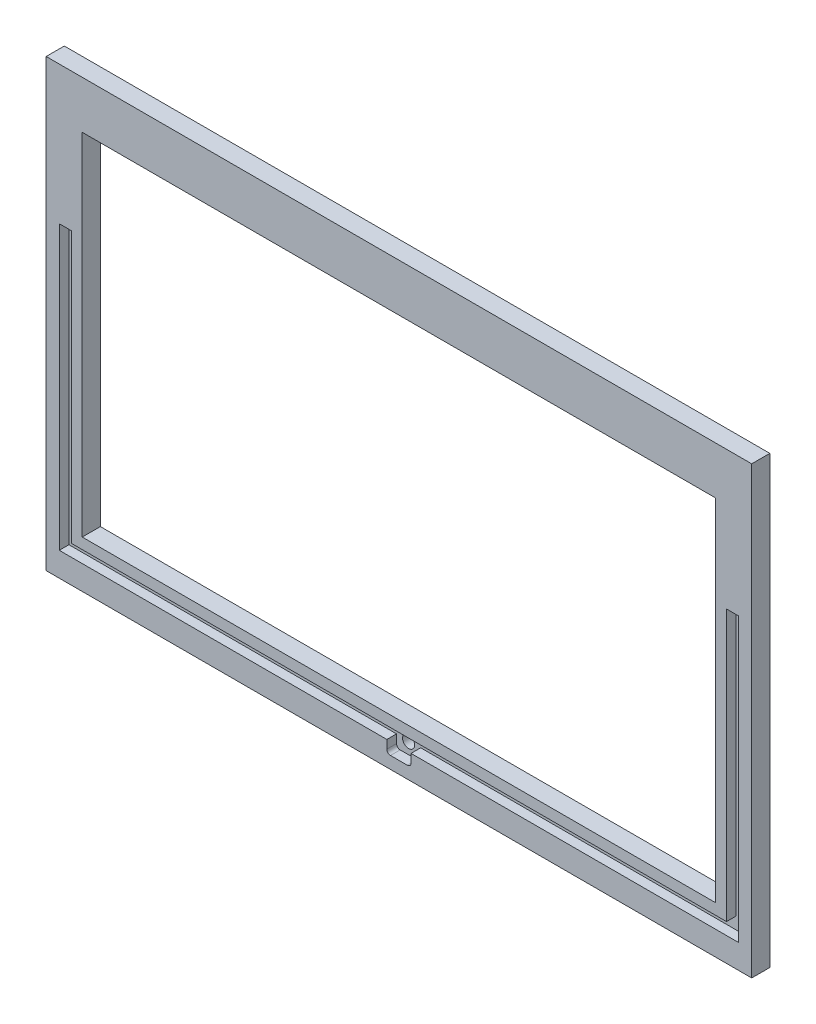
ISO-10303-21;
HEADER;
FILE_DESCRIPTION(('STEP AP214'),'2;1');
FILE_NAME('part.step','',(''),(''),'','','');
FILE_SCHEMA(('AUTOMOTIVE_DESIGN { 1 0 10303 214 1 1 1 1 }'));
ENDSEC;
DATA;
#1=APPLICATION_CONTEXT('core data for automotive mechanical design processes');
#2=APPLICATION_PROTOCOL_DEFINITION('international standard','automotive_design',2000,#1);
#3=PRODUCT_CONTEXT('',#1,'mechanical');
#4=PRODUCT('Part','Part','',(#3));
#5=PRODUCT_RELATED_PRODUCT_CATEGORY('part','',(#4));
#6=PRODUCT_DEFINITION_FORMATION('','',#4);
#7=PRODUCT_DEFINITION_CONTEXT('part definition',#1,'design');
#8=PRODUCT_DEFINITION('design','',#6,#7);
#9=PRODUCT_DEFINITION_SHAPE('','',#8);
#10=(LENGTH_UNIT() NAMED_UNIT(*) SI_UNIT(.MILLI.,.METRE.));
#11=(NAMED_UNIT(*) PLANE_ANGLE_UNIT() SI_UNIT($,.RADIAN.));
#12=(NAMED_UNIT(*) SI_UNIT($,.STERADIAN.) SOLID_ANGLE_UNIT());
#13=UNCERTAINTY_MEASURE_WITH_UNIT(LENGTH_MEASURE(1.E-05),#10,'distance_accuracy_value','');
#14=(GEOMETRIC_REPRESENTATION_CONTEXT(3) GLOBAL_UNCERTAINTY_ASSIGNED_CONTEXT((#13)) GLOBAL_UNIT_ASSIGNED_CONTEXT((#10,
#11,#12)) REPRESENTATION_CONTEXT('',''));
#15=CARTESIAN_POINT('',(0.,0.,0.));
#16=DIRECTION('',(0.,0.,1.));
#17=DIRECTION('',(1.,0.,0.));
#18=AXIS2_PLACEMENT_3D('',#15,#16,#17);
#19=CARTESIAN_POINT('',(-198.344280860262,216.31168009206,15.));
#20=DIRECTION('',(0.,-1.,0.));
#21=DIRECTION('',(0.,0.,-1.));
#22=AXIS2_PLACEMENT_3D('',#19,#20,#21);
#23=PLANE('',#22);
#24=DIRECTION('',(-1.,0.,0.));
#25=VECTOR('',#24,1.);
#26=CARTESIAN_POINT('',(-198.344280860262,216.31168009206,0.));
#27=LINE('',#26,#25);
#28=CARTESIAN_POINT('',(375.355719139738,216.31168009206,0.));
#29=VERTEX_POINT('',#28);
#30=CARTESIAN_POINT('',(-208.344280860262,216.31168009206,0.));
#31=VERTEX_POINT('',#30);
#32=EDGE_CURVE('E350',#29,#31,#27,.T.);
#33=ORIENTED_EDGE('',*,*,#32,.T.);
#34=DIRECTION('',(0.,0.,1.));
#35=VECTOR('',#34,1.);
#36=CARTESIAN_POINT('',(-208.344280860262,216.31168009206,-348.543483657348));
#37=LINE('',#36,#35);
#38=CARTESIAN_POINT('',(-208.344280860262,216.31168009206,15.));
#39=VERTEX_POINT('',#38);
#40=EDGE_CURVE('E333',#31,#39,#37,.T.);
#41=ORIENTED_EDGE('',*,*,#40,.T.);
#42=DIRECTION('',(-1.,0.,0.));
#43=VECTOR('',#42,1.);
#44=CARTESIAN_POINT('',(-198.344280860262,216.31168009206,15.));
#45=LINE('',#44,#43);
#46=CARTESIAN_POINT('',(375.355719139738,216.31168009206,15.));
#47=VERTEX_POINT('',#46);
#48=EDGE_CURVE('E356',#47,#39,#45,.T.);
#49=ORIENTED_EDGE('',*,*,#48,.F.);
#50=DIRECTION('',(0.,0.,1.));
#51=VECTOR('',#50,1.);
#52=CARTESIAN_POINT('',(375.355719139738,216.31168009206,-348.543483657348));
#53=LINE('',#52,#51);
#54=EDGE_CURVE('E325',#29,#47,#53,.T.);
#55=ORIENTED_EDGE('',*,*,#54,.F.);
#56=EDGE_LOOP('',(#33,#41,#49,#55));
#57=FACE_BOUND('',#56,.T.);
#58=ADVANCED_FACE('F47',(#57),#23,.F.);
#59=CARTESIAN_POINT('',(0.,0.,15.));
#60=DIRECTION('',(0.,0.,1.));
#61=DIRECTION('',(1.,0.,0.));
#62=AXIS2_PLACEMENT_3D('',#59,#60,#61);
#63=PLANE('',#62);
#64=DIRECTION('',(-1.,0.,0.));
#65=VECTOR('',#64,1.);
#66=CARTESIAN_POINT('',(0.,101.91168009206,15.));
#67=LINE('',#66,#65);
#68=CARTESIAN_POINT('',(364.505719139738,101.91168009206,15.));
#69=VERTEX_POINT('',#68);
#70=CARTESIAN_POINT('',(354.505719139738,101.91168009206,15.));
#71=VERTEX_POINT('',#70);
#72=EDGE_CURVE('E61',#69,#71,#67,.T.);
#73=ORIENTED_EDGE('',*,*,#72,.F.);
#74=DIRECTION('',(0.,-1.,0.));
#75=VECTOR('',#74,1.);
#76=CARTESIAN_POINT('',(364.505719139738,0.,15.));
#77=LINE('',#76,#75);
#78=CARTESIAN_POINT('',(364.505719139738,-132.08831990794,15.));
#79=VERTEX_POINT('',#78);
#80=EDGE_CURVE('E216',#69,#79,#77,.T.);
#81=ORIENTED_EDGE('',*,*,#80,.T.);
#82=DIRECTION('',(-1.,0.,0.));
#83=VECTOR('',#82,1.);
#84=CARTESIAN_POINT('',(0.,-132.08831990794,15.));
#85=LINE('',#84,#83);
#86=CARTESIAN_POINT('',(93.5057191397382,-132.08831990794,15.));
#87=VERTEX_POINT('',#86);
#88=EDGE_CURVE('E219',#79,#87,#85,.T.);
#89=ORIENTED_EDGE('',*,*,#88,.T.);
#90=DIRECTION('',(0.,-1.,0.));
#91=VECTOR('',#90,1.);
#92=CARTESIAN_POINT('',(93.5057191397382,0.,15.));
#93=LINE('',#92,#91);
#94=CARTESIAN_POINT('',(93.5057191397382,-139.08831990794,15.));
#95=VERTEX_POINT('',#94);
#96=EDGE_CURVE('E279',#87,#95,#93,.T.);
#97=ORIENTED_EDGE('',*,*,#96,.T.);
#98=CARTESIAN_POINT('',(90.5057191397382,-139.08831990794,15.));
#99=DIRECTION('',(0.,0.,1.));
#100=DIRECTION('',(1.,0.,0.));
#101=AXIS2_PLACEMENT_3D('',#98,#99,#100);
#102=CIRCLE('',#101,3.);
#103=CARTESIAN_POINT('',(90.5057191397382,-142.08831990794,15.));
#104=VERTEX_POINT('',#103);
#105=EDGE_CURVE('E276',#95,#104,#102,.F.);
#106=ORIENTED_EDGE('',*,*,#105,.T.);
#107=DIRECTION('',(-1.,0.,0.));
#108=VECTOR('',#107,1.);
#109=CARTESIAN_POINT('',(0.,-142.08831990794,15.));
#110=LINE('',#109,#108);
#111=CARTESIAN_POINT('',(76.5057191397382,-142.08831990794,15.));
#112=VERTEX_POINT('',#111);
#113=EDGE_CURVE('E273',#104,#112,#110,.T.);
#114=ORIENTED_EDGE('',*,*,#113,.T.);
#115=CARTESIAN_POINT('',(76.5057191397382,-139.08831990794,15.));
#116=DIRECTION('',(0.,0.,1.));
#117=DIRECTION('',(1.,0.,0.));
#118=AXIS2_PLACEMENT_3D('',#115,#116,#117);
#119=CIRCLE('',#118,3.);
#120=CARTESIAN_POINT('',(73.5057191397382,-139.08831990794,15.));
#121=VERTEX_POINT('',#120);
#122=EDGE_CURVE('E270',#112,#121,#119,.F.);
#123=ORIENTED_EDGE('',*,*,#122,.T.);
#124=DIRECTION('',(0.,-1.,0.));
#125=VECTOR('',#124,1.);
#126=CARTESIAN_POINT('',(73.5057191397382,0.,15.));
#127=LINE('',#126,#125);
#128=CARTESIAN_POINT('',(73.5057191397382,-132.08831990794,15.));
#129=VERTEX_POINT('',#128);
#130=EDGE_CURVE('E267',#129,#121,#127,.T.);
#131=ORIENTED_EDGE('',*,*,#130,.F.);
#132=DIRECTION('',(-1.,0.,0.));
#133=VECTOR('',#132,1.);
#134=CARTESIAN_POINT('',(0.,-132.08831990794,15.));
#135=LINE('',#134,#133);
#136=CARTESIAN_POINT('',(-197.494280860262,-132.08831990794,15.));
#137=VERTEX_POINT('',#136);
#138=EDGE_CURVE('E264',#129,#137,#135,.T.);
#139=ORIENTED_EDGE('',*,*,#138,.T.);
#140=DIRECTION('',(0.,1.,0.));
#141=VECTOR('',#140,1.);
#142=CARTESIAN_POINT('',(-197.494280860262,0.,15.));
#143=LINE('',#142,#141);
#144=CARTESIAN_POINT('',(-197.494280860262,101.91168009206,15.));
#145=VERTEX_POINT('',#144);
#146=EDGE_CURVE('E261',#137,#145,#143,.T.);
#147=ORIENTED_EDGE('',*,*,#146,.T.);
#148=DIRECTION('',(1.,0.,0.));
#149=VECTOR('',#148,1.);
#150=CARTESIAN_POINT('',(0.,101.91168009206,15.));
#151=LINE('',#150,#149);
#152=CARTESIAN_POINT('',(-187.494280860262,101.91168009206,15.));
#153=VERTEX_POINT('',#152);
#154=EDGE_CURVE('E258',#145,#153,#151,.T.);
#155=ORIENTED_EDGE('',*,*,#154,.T.);
#156=DIRECTION('',(0.,1.,0.));
#157=VECTOR('',#156,1.);
#158=CARTESIAN_POINT('',(-187.494280860262,0.,15.));
#159=LINE('',#158,#157);
#160=CARTESIAN_POINT('',(-187.494280860262,-122.08831990794,15.));
#161=VERTEX_POINT('',#160);
#162=EDGE_CURVE('E255',#161,#153,#159,.T.);
#163=ORIENTED_EDGE('',*,*,#162,.F.);
#164=DIRECTION('',(-1.,0.,0.));
#165=VECTOR('',#164,1.);
#166=CARTESIAN_POINT('',(0.,-122.08831990794,15.));
#167=LINE('',#166,#165);
#168=CARTESIAN_POINT('',(354.505719139738,-122.08831990794,15.));
#169=VERTEX_POINT('',#168);
#170=EDGE_CURVE('E252',#169,#161,#167,.T.);
#171=ORIENTED_EDGE('',*,*,#170,.F.);
#172=DIRECTION('',(0.,-1.,0.));
#173=VECTOR('',#172,1.);
#174=CARTESIAN_POINT('',(354.505719139738,0.,15.));
#175=LINE('',#174,#173);
#176=EDGE_CURVE('E250',#71,#169,#175,.T.);
#177=ORIENTED_EDGE('',*,*,#176,.F.);
#178=EDGE_LOOP('',(#73,#81,#89,#97,#106,#114,#123,#131,#139,#147,#155,#163,#171,#177));
#179=FACE_BOUND('',#178,.T.);
#180=DIRECTION('',(0.,-1.,0.));
#181=VECTOR('',#180,1.);
#182=CARTESIAN_POINT('',(-178.494280860262,176.91168009206,15.));
#183=LINE('',#182,#181);
#184=CARTESIAN_POINT('',(-178.494280860262,176.91168009206,15.));
#185=VERTEX_POINT('',#184);
#186=CARTESIAN_POINT('',(-178.494280860262,-113.08831990794,15.));
#187=VERTEX_POINT('',#186);
#188=EDGE_CURVE('E69',#185,#187,#183,.T.);
#189=ORIENTED_EDGE('',*,*,#188,.F.);
#190=DIRECTION('',(-1.,0.,0.));
#191=VECTOR('',#190,1.);
#192=CARTESIAN_POINT('',(-178.494280860262,176.91168009206,15.));
#193=LINE('',#192,#191);
#194=CARTESIAN_POINT('',(345.505719139738,176.91168009206,15.));
#195=VERTEX_POINT('',#194);
#196=EDGE_CURVE('E344',#195,#185,#193,.T.);
#197=ORIENTED_EDGE('',*,*,#196,.F.);
#198=DIRECTION('',(0.,1.,0.));
#199=VECTOR('',#198,1.);
#200=CARTESIAN_POINT('',(345.505719139738,176.91168009206,15.));
#201=LINE('',#200,#199);
#202=CARTESIAN_POINT('',(345.505719139738,-113.08831990794,15.));
#203=VERTEX_POINT('',#202);
#204=EDGE_CURVE('E341',#203,#195,#201,.T.);
#205=ORIENTED_EDGE('',*,*,#204,.F.);
#206=DIRECTION('',(1.,0.,0.));
#207=VECTOR('',#206,1.);
#208=CARTESIAN_POINT('',(-178.494280860262,-113.08831990794,15.));
#209=LINE('',#208,#207);
#210=EDGE_CURVE('E338',#187,#203,#209,.T.);
#211=ORIENTED_EDGE('',*,*,#210,.F.);
#212=EDGE_LOOP('',(#189,#197,#205,#211));
#213=FACE_BOUND('',#212,.T.);
#214=DIRECTION('',(0.,-1.,0.));
#215=VECTOR('',#214,1.);
#216=CARTESIAN_POINT('',(-208.344280860262,216.31168009206,15.));
#217=LINE('',#216,#215);
#218=CARTESIAN_POINT('',(-208.344280860262,-152.08831990794,15.));
#219=VERTEX_POINT('',#218);
#220=EDGE_CURVE('E324',#39,#219,#217,.T.);
#221=ORIENTED_EDGE('',*,*,#220,.T.);
#222=DIRECTION('',(1.,0.,0.));
#223=VECTOR('',#222,1.);
#224=CARTESIAN_POINT('',(-208.344280860262,-152.08831990794,15.));
#225=LINE('',#224,#223);
#226=CARTESIAN_POINT('',(375.355719139738,-152.08831990794,15.));
#227=VERTEX_POINT('',#226);
#228=EDGE_CURVE('E286',#219,#227,#225,.T.);
#229=ORIENTED_EDGE('',*,*,#228,.T.);
#230=DIRECTION('',(0.,1.,0.));
#231=VECTOR('',#230,1.);
#232=CARTESIAN_POINT('',(375.355719139738,216.31168009206,15.));
#233=LINE('',#232,#231);
#234=EDGE_CURVE('E321',#227,#47,#233,.T.);
#235=ORIENTED_EDGE('',*,*,#234,.T.);
#236=ORIENTED_EDGE('',*,*,#48,.T.);
#237=EDGE_LOOP('',(#221,#229,#235,#236));
#238=FACE_BOUND('',#237,.T.);
#239=ADVANCED_FACE('F379',(#179,#213,#238),#63,.T.);
#240=CARTESIAN_POINT('',(0.,0.,0.));
#241=DIRECTION('',(0.,0.,1.));
#242=DIRECTION('',(1.,0.,0.));
#243=AXIS2_PLACEMENT_3D('',#240,#241,#242);
#244=PLANE('',#243);
#245=CARTESIAN_POINT('',(83.5057191397382,-132.58831990794,0.));
#246=DIRECTION('',(0.,0.,1.));
#247=DIRECTION('',(1.,0.,0.));
#248=AXIS2_PLACEMENT_3D('',#245,#246,#247);
#249=CIRCLE('',#248,5.00000000000001);
#250=CARTESIAN_POINT('',(88.5057191397382,-132.58831990794,0.));
#251=VERTEX_POINT('',#250);
#252=EDGE_CURVE('E222',#251,#251,#249,.T.);
#253=ORIENTED_EDGE('',*,*,#252,.T.);
#254=EDGE_LOOP('',(#253));
#255=FACE_BOUND('',#254,.T.);
#256=DIRECTION('',(-1.,0.,0.));
#257=VECTOR('',#256,1.);
#258=CARTESIAN_POINT('',(0.,176.91168009206,0.));
#259=LINE('',#258,#257);
#260=CARTESIAN_POINT('',(345.505719139738,176.91168009206,0.));
#261=VERTEX_POINT('',#260);
#262=CARTESIAN_POINT('',(-178.494280860262,176.91168009206,0.));
#263=VERTEX_POINT('',#262);
#264=EDGE_CURVE('E54',#261,#263,#259,.T.);
#265=ORIENTED_EDGE('',*,*,#264,.T.);
#266=DIRECTION('',(0.,-1.,0.));
#267=VECTOR('',#266,1.);
#268=CARTESIAN_POINT('',(-178.494280860262,0.,0.));
#269=LINE('',#268,#267);
#270=CARTESIAN_POINT('',(-178.494280860262,-113.08831990794,0.));
#271=VERTEX_POINT('',#270);
#272=EDGE_CURVE('E12',#263,#271,#269,.T.);
#273=ORIENTED_EDGE('',*,*,#272,.T.);
#274=DIRECTION('',(1.,0.,0.));
#275=VECTOR('',#274,1.);
#276=CARTESIAN_POINT('',(0.,-113.08831990794,0.));
#277=LINE('',#276,#275);
#278=CARTESIAN_POINT('',(345.505719139738,-113.08831990794,0.));
#279=VERTEX_POINT('',#278);
#280=EDGE_CURVE('E358',#271,#279,#277,.T.);
#281=ORIENTED_EDGE('',*,*,#280,.T.);
#282=DIRECTION('',(0.,1.,0.));
#283=VECTOR('',#282,1.);
#284=CARTESIAN_POINT('',(345.505719139738,0.,0.));
#285=LINE('',#284,#283);
#286=EDGE_CURVE('E362',#279,#261,#285,.T.);
#287=ORIENTED_EDGE('',*,*,#286,.T.);
#288=EDGE_LOOP('',(#265,#273,#281,#287));
#289=FACE_BOUND('',#288,.T.);
#290=ORIENTED_EDGE('',*,*,#32,.F.);
#291=DIRECTION('',(0.,-1.,0.));
#292=VECTOR('',#291,1.);
#293=CARTESIAN_POINT('',(375.355719139738,216.31168009206,0.));
#294=LINE('',#293,#292);
#295=CARTESIAN_POINT('',(375.355719139738,-152.08831990794,0.));
#296=VERTEX_POINT('',#295);
#297=EDGE_CURVE('E322',#29,#296,#294,.T.);
#298=ORIENTED_EDGE('',*,*,#297,.T.);
#299=DIRECTION('',(-1.,0.,0.));
#300=VECTOR('',#299,1.);
#301=CARTESIAN_POINT('',(-208.344280860262,-152.08831990794,0.));
#302=LINE('',#301,#300);
#303=CARTESIAN_POINT('',(-208.344280860262,-152.08831990794,0.));
#304=VERTEX_POINT('',#303);
#305=EDGE_CURVE('E316',#296,#304,#302,.T.);
#306=ORIENTED_EDGE('',*,*,#305,.T.);
#307=DIRECTION('',(0.,1.,0.));
#308=VECTOR('',#307,1.);
#309=CARTESIAN_POINT('',(-208.344280860262,216.31168009206,0.));
#310=LINE('',#309,#308);
#311=EDGE_CURVE('E330',#304,#31,#310,.T.);
#312=ORIENTED_EDGE('',*,*,#311,.T.);
#313=EDGE_LOOP('',(#290,#298,#306,#312));
#314=FACE_BOUND('',#313,.T.);
#315=ADVANCED_FACE('F366',(#255,#289,#314),#244,.F.);
#316=CARTESIAN_POINT('',(-178.494280860262,176.91168009206,-55.));
#317=DIRECTION('',(-1.,0.,0.));
#318=DIRECTION('',(0.,-1.,0.));
#319=AXIS2_PLACEMENT_3D('',#316,#317,#318);
#320=PLANE('',#319);
#321=DIRECTION('',(0.,0.,1.));
#322=VECTOR('',#321,1.);
#323=CARTESIAN_POINT('',(-178.494280860262,176.91168009206,-55.));
#324=LINE('',#323,#322);
#325=EDGE_CURVE('E348',#263,#185,#324,.T.);
#326=ORIENTED_EDGE('',*,*,#325,.T.);
#327=ORIENTED_EDGE('',*,*,#188,.T.);
#328=DIRECTION('',(0.,0.,1.));
#329=VECTOR('',#328,1.);
#330=CARTESIAN_POINT('',(-178.494280860262,-113.08831990794,-55.));
#331=LINE('',#330,#329);
#332=EDGE_CURVE('E347',#271,#187,#331,.T.);
#333=ORIENTED_EDGE('',*,*,#332,.F.);
#334=ORIENTED_EDGE('',*,*,#272,.F.);
#335=EDGE_LOOP('',(#326,#327,#333,#334));
#336=FACE_BOUND('',#335,.T.);
#337=ADVANCED_FACE('F383',(#336),#320,.F.);
#338=CARTESIAN_POINT('',(-178.494280860262,176.91168009206,-55.));
#339=DIRECTION('',(0.,1.,0.));
#340=DIRECTION('',(0.,0.,1.));
#341=AXIS2_PLACEMENT_3D('',#338,#339,#340);
#342=PLANE('',#341);
#343=DIRECTION('',(0.,0.,1.));
#344=VECTOR('',#343,1.);
#345=CARTESIAN_POINT('',(345.505719139738,176.91168009206,-55.));
#346=LINE('',#345,#344);
#347=EDGE_CURVE('E351',#261,#195,#346,.T.);
#348=ORIENTED_EDGE('',*,*,#347,.T.);
#349=ORIENTED_EDGE('',*,*,#196,.T.);
#350=ORIENTED_EDGE('',*,*,#325,.F.);
#351=ORIENTED_EDGE('',*,*,#264,.F.);
#352=EDGE_LOOP('',(#348,#349,#350,#351));
#353=FACE_BOUND('',#352,.T.);
#354=ADVANCED_FACE('F372',(#353),#342,.F.);
#355=CARTESIAN_POINT('',(345.505719139738,176.91168009206,-55.));
#356=DIRECTION('',(1.,0.,0.));
#357=DIRECTION('',(0.,0.,-1.));
#358=AXIS2_PLACEMENT_3D('',#355,#356,#357);
#359=PLANE('',#358);
#360=DIRECTION('',(0.,0.,1.));
#361=VECTOR('',#360,1.);
#362=CARTESIAN_POINT('',(345.505719139738,-113.08831990794,-55.));
#363=LINE('',#362,#361);
#364=EDGE_CURVE('E353',#279,#203,#363,.T.);
#365=ORIENTED_EDGE('',*,*,#364,.T.);
#366=ORIENTED_EDGE('',*,*,#204,.T.);
#367=ORIENTED_EDGE('',*,*,#347,.F.);
#368=ORIENTED_EDGE('',*,*,#286,.F.);
#369=EDGE_LOOP('',(#365,#366,#367,#368));
#370=FACE_BOUND('',#369,.T.);
#371=ADVANCED_FACE('F374',(#370),#359,.F.);
#372=CARTESIAN_POINT('',(-178.494280860262,-113.08831990794,-55.));
#373=DIRECTION('',(0.,-1.,0.));
#374=DIRECTION('',(0.,0.,-1.));
#375=AXIS2_PLACEMENT_3D('',#372,#373,#374);
#376=PLANE('',#375);
#377=ORIENTED_EDGE('',*,*,#332,.T.);
#378=ORIENTED_EDGE('',*,*,#210,.T.);
#379=ORIENTED_EDGE('',*,*,#364,.F.);
#380=ORIENTED_EDGE('',*,*,#280,.F.);
#381=EDGE_LOOP('',(#377,#378,#379,#380));
#382=FACE_BOUND('',#381,.T.);
#383=ADVANCED_FACE('F382',(#382),#376,.F.);
#384=CARTESIAN_POINT('',(-208.344280860262,216.31168009206,-348.543483657348));
#385=DIRECTION('',(-1.,0.,0.));
#386=DIRECTION('',(0.,-1.,0.));
#387=AXIS2_PLACEMENT_3D('',#384,#385,#386);
#388=PLANE('',#387);
#389=ORIENTED_EDGE('',*,*,#311,.F.);
#390=DIRECTION('',(0.,0.,1.));
#391=VECTOR('',#390,1.);
#392=CARTESIAN_POINT('',(-208.344280860262,-152.08831990794,-584.042541258768));
#393=LINE('',#392,#391);
#394=EDGE_CURVE('E312',#304,#219,#393,.T.);
#395=ORIENTED_EDGE('',*,*,#394,.T.);
#396=ORIENTED_EDGE('',*,*,#220,.F.);
#397=ORIENTED_EDGE('',*,*,#40,.F.);
#398=EDGE_LOOP('',(#389,#395,#396,#397));
#399=FACE_BOUND('',#398,.T.);
#400=ADVANCED_FACE('F407',(#399),#388,.T.);
#401=CARTESIAN_POINT('',(375.355719139738,216.31168009206,-348.543483657348));
#402=DIRECTION('',(1.,0.,0.));
#403=DIRECTION('',(0.,1.,0.));
#404=AXIS2_PLACEMENT_3D('',#401,#402,#403);
#405=PLANE('',#404);
#406=ORIENTED_EDGE('',*,*,#297,.F.);
#407=ORIENTED_EDGE('',*,*,#54,.T.);
#408=ORIENTED_EDGE('',*,*,#234,.F.);
#409=DIRECTION('',(0.,0.,1.));
#410=VECTOR('',#409,1.);
#411=CARTESIAN_POINT('',(375.355719139738,-152.08831990794,-584.042541258768));
#412=LINE('',#411,#410);
#413=EDGE_CURVE('E313',#296,#227,#412,.T.);
#414=ORIENTED_EDGE('',*,*,#413,.F.);
#415=EDGE_LOOP('',(#406,#407,#408,#414));
#416=FACE_BOUND('',#415,.T.);
#417=ADVANCED_FACE('F410',(#416),#405,.T.);
#418=CARTESIAN_POINT('',(-208.344280860262,-152.08831990794,-584.042541258768));
#419=DIRECTION('',(0.,-1.,0.));
#420=DIRECTION('',(0.,0.,-1.));
#421=AXIS2_PLACEMENT_3D('',#418,#419,#420);
#422=PLANE('',#421);
#423=ORIENTED_EDGE('',*,*,#305,.F.);
#424=ORIENTED_EDGE('',*,*,#413,.T.);
#425=ORIENTED_EDGE('',*,*,#228,.F.);
#426=ORIENTED_EDGE('',*,*,#394,.F.);
#427=EDGE_LOOP('',(#423,#424,#425,#426));
#428=FACE_BOUND('',#427,.T.);
#429=ADVANCED_FACE('F413',(#428),#422,.T.);
#430=CARTESIAN_POINT('',(0.,101.91168009206,7.));
#431=DIRECTION('',(0.,1.,0.));
#432=DIRECTION('',(0.,0.,1.));
#433=AXIS2_PLACEMENT_3D('',#430,#431,#432);
#434=PLANE('',#433);
#435=ORIENTED_EDGE('',*,*,#72,.T.);
#436=DIRECTION('',(0.,0.,1.));
#437=VECTOR('',#436,1.);
#438=CARTESIAN_POINT('',(354.505719139738,101.91168009206,7.));
#439=LINE('',#438,#437);
#440=CARTESIAN_POINT('',(354.505719139738,101.91168009206,7.));
#441=VERTEX_POINT('',#440);
#442=EDGE_CURVE('E194',#441,#71,#439,.T.);
#443=ORIENTED_EDGE('',*,*,#442,.F.);
#444=DIRECTION('',(-1.,0.,0.));
#445=VECTOR('',#444,1.);
#446=CARTESIAN_POINT('',(0.,101.91168009206,7.));
#447=LINE('',#446,#445);
#448=CARTESIAN_POINT('',(364.505719139738,101.91168009206,7.));
#449=VERTEX_POINT('',#448);
#450=EDGE_CURVE('E198',#449,#441,#447,.T.);
#451=ORIENTED_EDGE('',*,*,#450,.F.);
#452=DIRECTION('',(0.,0.,1.));
#453=VECTOR('',#452,1.);
#454=CARTESIAN_POINT('',(364.505719139738,101.91168009206,7.));
#455=LINE('',#454,#453);
#456=EDGE_CURVE('E284',#449,#69,#455,.T.);
#457=ORIENTED_EDGE('',*,*,#456,.T.);
#458=EDGE_LOOP('',(#435,#443,#451,#457));
#459=FACE_BOUND('',#458,.T.);
#460=ADVANCED_FACE('F196',(#459),#434,.F.);
#461=CARTESIAN_POINT('',(364.505719139738,0.,7.));
#462=DIRECTION('',(-1.,0.,0.));
#463=DIRECTION('',(0.,-1.,0.));
#464=AXIS2_PLACEMENT_3D('',#461,#462,#463);
#465=PLANE('',#464);
#466=ORIENTED_EDGE('',*,*,#80,.F.);
#467=ORIENTED_EDGE('',*,*,#456,.F.);
#468=DIRECTION('',(0.,-1.,0.));
#469=VECTOR('',#468,1.);
#470=CARTESIAN_POINT('',(364.505719139738,0.,7.));
#471=LINE('',#470,#469);
#472=CARTESIAN_POINT('',(364.505719139738,-132.08831990794,7.));
#473=VERTEX_POINT('',#472);
#474=EDGE_CURVE('E203',#449,#473,#471,.T.);
#475=ORIENTED_EDGE('',*,*,#474,.T.);
#476=DIRECTION('',(0.,0.,1.));
#477=VECTOR('',#476,1.);
#478=CARTESIAN_POINT('',(364.505719139738,-132.08831990794,7.));
#479=LINE('',#478,#477);
#480=EDGE_CURVE('E287',#473,#79,#479,.T.);
#481=ORIENTED_EDGE('',*,*,#480,.T.);
#482=EDGE_LOOP('',(#466,#467,#475,#481));
#483=FACE_BOUND('',#482,.T.);
#484=ADVANCED_FACE('F420',(#483),#465,.T.);
#485=CARTESIAN_POINT('',(0.,-132.08831990794,7.));
#486=DIRECTION('',(0.,1.,0.));
#487=DIRECTION('',(0.,0.,1.));
#488=AXIS2_PLACEMENT_3D('',#485,#486,#487);
#489=PLANE('',#488);
#490=ORIENTED_EDGE('',*,*,#88,.F.);
#491=ORIENTED_EDGE('',*,*,#480,.F.);
#492=DIRECTION('',(-1.,0.,0.));
#493=VECTOR('',#492,1.);
#494=CARTESIAN_POINT('',(0.,-132.08831990794,7.));
#495=LINE('',#494,#493);
#496=CARTESIAN_POINT('',(93.5057191397382,-132.08831990794,7.));
#497=VERTEX_POINT('',#496);
#498=EDGE_CURVE('E246',#473,#497,#495,.T.);
#499=ORIENTED_EDGE('',*,*,#498,.T.);
#500=DIRECTION('',(0.,0.,1.));
#501=VECTOR('',#500,1.);
#502=CARTESIAN_POINT('',(93.5057191397382,-132.08831990794,7.));
#503=LINE('',#502,#501);
#504=EDGE_CURVE('E289',#497,#87,#503,.T.);
#505=ORIENTED_EDGE('',*,*,#504,.T.);
#506=EDGE_LOOP('',(#490,#491,#499,#505));
#507=FACE_BOUND('',#506,.T.);
#508=ADVANCED_FACE('F469',(#507),#489,.T.);
#509=CARTESIAN_POINT('',(93.5057191397382,0.,7.));
#510=DIRECTION('',(-1.,0.,0.));
#511=DIRECTION('',(0.,0.,1.));
#512=AXIS2_PLACEMENT_3D('',#509,#510,#511);
#513=PLANE('',#512);
#514=ORIENTED_EDGE('',*,*,#96,.F.);
#515=ORIENTED_EDGE('',*,*,#504,.F.);
#516=DIRECTION('',(0.,-1.,0.));
#517=VECTOR('',#516,1.);
#518=CARTESIAN_POINT('',(93.5057191397382,0.,7.));
#519=LINE('',#518,#517);
#520=CARTESIAN_POINT('',(93.5057191397382,-139.08831990794,7.));
#521=VERTEX_POINT('',#520);
#522=EDGE_CURVE('E244',#497,#521,#519,.T.);
#523=ORIENTED_EDGE('',*,*,#522,.T.);
#524=DIRECTION('',(0.,0.,1.));
#525=VECTOR('',#524,1.);
#526=CARTESIAN_POINT('',(93.5057191397382,-139.08831990794,7.));
#527=LINE('',#526,#525);
#528=EDGE_CURVE('E291',#521,#95,#527,.T.);
#529=ORIENTED_EDGE('',*,*,#528,.T.);
#530=EDGE_LOOP('',(#514,#515,#523,#529));
#531=FACE_BOUND('',#530,.T.);
#532=ADVANCED_FACE('F480',(#531),#513,.T.);
#533=CARTESIAN_POINT('',(90.5057191397382,-139.08831990794,7.));
#534=DIRECTION('',(0.,0.,1.));
#535=DIRECTION('',(1.,0.,0.));
#536=AXIS2_PLACEMENT_3D('',#533,#534,#535);
#537=CYLINDRICAL_SURFACE('',#536,3.);
#538=ORIENTED_EDGE('',*,*,#105,.F.);
#539=ORIENTED_EDGE('',*,*,#528,.F.);
#540=CARTESIAN_POINT('',(90.5057191397382,-139.08831990794,7.));
#541=DIRECTION('',(0.,0.,1.));
#542=DIRECTION('',(1.,0.,0.));
#543=AXIS2_PLACEMENT_3D('',#540,#541,#542);
#544=CIRCLE('',#543,3.);
#545=CARTESIAN_POINT('',(90.5057191397382,-142.08831990794,7.));
#546=VERTEX_POINT('',#545);
#547=EDGE_CURVE('E242',#521,#546,#544,.F.);
#548=ORIENTED_EDGE('',*,*,#547,.T.);
#549=DIRECTION('',(0.,0.,1.));
#550=VECTOR('',#549,1.);
#551=CARTESIAN_POINT('',(90.5057191397382,-142.08831990794,7.));
#552=LINE('',#551,#550);
#553=EDGE_CURVE('E293',#546,#104,#552,.T.);
#554=ORIENTED_EDGE('',*,*,#553,.T.);
#555=EDGE_LOOP('',(#538,#539,#548,#554));
#556=FACE_BOUND('',#555,.T.);
#557=ADVANCED_FACE('F490',(#556),#537,.F.);
#558=CARTESIAN_POINT('',(0.,-142.08831990794,7.));
#559=DIRECTION('',(0.,1.,0.));
#560=DIRECTION('',(0.,0.,1.));
#561=AXIS2_PLACEMENT_3D('',#558,#559,#560);
#562=PLANE('',#561);
#563=ORIENTED_EDGE('',*,*,#113,.F.);
#564=ORIENTED_EDGE('',*,*,#553,.F.);
#565=DIRECTION('',(-1.,0.,0.));
#566=VECTOR('',#565,1.);
#567=CARTESIAN_POINT('',(0.,-142.08831990794,7.));
#568=LINE('',#567,#566);
#569=CARTESIAN_POINT('',(76.5057191397382,-142.08831990794,7.));
#570=VERTEX_POINT('',#569);
#571=EDGE_CURVE('E240',#546,#570,#568,.T.);
#572=ORIENTED_EDGE('',*,*,#571,.T.);
#573=DIRECTION('',(0.,0.,1.));
#574=VECTOR('',#573,1.);
#575=CARTESIAN_POINT('',(76.5057191397382,-142.08831990794,7.));
#576=LINE('',#575,#574);
#577=EDGE_CURVE('E295',#570,#112,#576,.T.);
#578=ORIENTED_EDGE('',*,*,#577,.T.);
#579=EDGE_LOOP('',(#563,#564,#572,#578));
#580=FACE_BOUND('',#579,.T.);
#581=ADVANCED_FACE('F500',(#580),#562,.T.);
#582=CARTESIAN_POINT('',(76.5057191397382,-139.08831990794,7.));
#583=DIRECTION('',(0.,0.,1.));
#584=DIRECTION('',(1.,0.,0.));
#585=AXIS2_PLACEMENT_3D('',#582,#583,#584);
#586=CYLINDRICAL_SURFACE('',#585,3.);
#587=ORIENTED_EDGE('',*,*,#122,.F.);
#588=ORIENTED_EDGE('',*,*,#577,.F.);
#589=CARTESIAN_POINT('',(76.5057191397382,-139.08831990794,7.));
#590=DIRECTION('',(0.,0.,1.));
#591=DIRECTION('',(1.,0.,0.));
#592=AXIS2_PLACEMENT_3D('',#589,#590,#591);
#593=CIRCLE('',#592,3.);
#594=CARTESIAN_POINT('',(73.5057191397382,-139.08831990794,7.));
#595=VERTEX_POINT('',#594);
#596=EDGE_CURVE('E238',#570,#595,#593,.F.);
#597=ORIENTED_EDGE('',*,*,#596,.T.);
#598=DIRECTION('',(0.,0.,1.));
#599=VECTOR('',#598,1.);
#600=CARTESIAN_POINT('',(73.5057191397382,-139.08831990794,7.));
#601=LINE('',#600,#599);
#602=EDGE_CURVE('E297',#595,#121,#601,.T.);
#603=ORIENTED_EDGE('',*,*,#602,.T.);
#604=EDGE_LOOP('',(#587,#588,#597,#603));
#605=FACE_BOUND('',#604,.T.);
#606=ADVANCED_FACE('F510',(#605),#586,.F.);
#607=CARTESIAN_POINT('',(73.5057191397382,0.,7.));
#608=DIRECTION('',(-1.,0.,0.));
#609=DIRECTION('',(0.,0.,1.));
#610=AXIS2_PLACEMENT_3D('',#607,#608,#609);
#611=PLANE('',#610);
#612=ORIENTED_EDGE('',*,*,#130,.T.);
#613=ORIENTED_EDGE('',*,*,#602,.F.);
#614=DIRECTION('',(0.,-1.,0.));
#615=VECTOR('',#614,1.);
#616=CARTESIAN_POINT('',(73.5057191397382,0.,7.));
#617=LINE('',#616,#615);
#618=CARTESIAN_POINT('',(73.5057191397382,-132.08831990794,7.));
#619=VERTEX_POINT('',#618);
#620=EDGE_CURVE('E235',#619,#595,#617,.T.);
#621=ORIENTED_EDGE('',*,*,#620,.F.);
#622=DIRECTION('',(0.,0.,1.));
#623=VECTOR('',#622,1.);
#624=CARTESIAN_POINT('',(73.5057191397382,-132.08831990794,7.));
#625=LINE('',#624,#623);
#626=EDGE_CURVE('E299',#619,#129,#625,.T.);
#627=ORIENTED_EDGE('',*,*,#626,.T.);
#628=EDGE_LOOP('',(#612,#613,#621,#627));
#629=FACE_BOUND('',#628,.T.);
#630=ADVANCED_FACE('F520',(#629),#611,.F.);
#631=CARTESIAN_POINT('',(0.,-132.08831990794,7.));
#632=DIRECTION('',(0.,1.,0.));
#633=DIRECTION('',(-1.,0.,0.));
#634=AXIS2_PLACEMENT_3D('',#631,#632,#633);
#635=PLANE('',#634);
#636=ORIENTED_EDGE('',*,*,#138,.F.);
#637=ORIENTED_EDGE('',*,*,#626,.F.);
#638=DIRECTION('',(-1.,0.,0.));
#639=VECTOR('',#638,1.);
#640=CARTESIAN_POINT('',(0.,-132.08831990794,7.));
#641=LINE('',#640,#639);
#642=CARTESIAN_POINT('',(-197.494280860262,-132.08831990794,7.));
#643=VERTEX_POINT('',#642);
#644=EDGE_CURVE('E233',#619,#643,#641,.T.);
#645=ORIENTED_EDGE('',*,*,#644,.T.);
#646=DIRECTION('',(0.,0.,1.));
#647=VECTOR('',#646,1.);
#648=CARTESIAN_POINT('',(-197.494280860262,-132.08831990794,7.));
#649=LINE('',#648,#647);
#650=EDGE_CURVE('E301',#643,#137,#649,.T.);
#651=ORIENTED_EDGE('',*,*,#650,.T.);
#652=EDGE_LOOP('',(#636,#637,#645,#651));
#653=FACE_BOUND('',#652,.T.);
#654=ADVANCED_FACE('F530',(#653),#635,.T.);
#655=CARTESIAN_POINT('',(-197.494280860262,0.,7.));
#656=DIRECTION('',(1.,0.,0.));
#657=DIRECTION('',(0.,0.,-1.));
#658=AXIS2_PLACEMENT_3D('',#655,#656,#657);
#659=PLANE('',#658);
#660=ORIENTED_EDGE('',*,*,#146,.F.);
#661=ORIENTED_EDGE('',*,*,#650,.F.);
#662=DIRECTION('',(0.,1.,0.));
#663=VECTOR('',#662,1.);
#664=CARTESIAN_POINT('',(-197.494280860262,0.,7.));
#665=LINE('',#664,#663);
#666=CARTESIAN_POINT('',(-197.494280860262,101.91168009206,7.));
#667=VERTEX_POINT('',#666);
#668=EDGE_CURVE('E231',#643,#667,#665,.T.);
#669=ORIENTED_EDGE('',*,*,#668,.T.);
#670=DIRECTION('',(0.,0.,1.));
#671=VECTOR('',#670,1.);
#672=CARTESIAN_POINT('',(-197.494280860262,101.91168009206,7.));
#673=LINE('',#672,#671);
#674=EDGE_CURVE('E303',#667,#145,#673,.T.);
#675=ORIENTED_EDGE('',*,*,#674,.T.);
#676=EDGE_LOOP('',(#660,#661,#669,#675));
#677=FACE_BOUND('',#676,.T.);
#678=ADVANCED_FACE('F540',(#677),#659,.T.);
#679=CARTESIAN_POINT('',(0.,101.91168009206,7.));
#680=DIRECTION('',(0.,-1.,0.));
#681=DIRECTION('',(0.,0.,-1.));
#682=AXIS2_PLACEMENT_3D('',#679,#680,#681);
#683=PLANE('',#682);
#684=ORIENTED_EDGE('',*,*,#154,.F.);
#685=ORIENTED_EDGE('',*,*,#674,.F.);
#686=DIRECTION('',(1.,0.,0.));
#687=VECTOR('',#686,1.);
#688=CARTESIAN_POINT('',(0.,101.91168009206,7.));
#689=LINE('',#688,#687);
#690=CARTESIAN_POINT('',(-187.494280860262,101.91168009206,7.));
#691=VERTEX_POINT('',#690);
#692=EDGE_CURVE('E229',#667,#691,#689,.T.);
#693=ORIENTED_EDGE('',*,*,#692,.T.);
#694=DIRECTION('',(0.,0.,1.));
#695=VECTOR('',#694,1.);
#696=CARTESIAN_POINT('',(-187.494280860262,101.91168009206,7.));
#697=LINE('',#696,#695);
#698=EDGE_CURVE('E305',#691,#153,#697,.T.);
#699=ORIENTED_EDGE('',*,*,#698,.T.);
#700=EDGE_LOOP('',(#684,#685,#693,#699));
#701=FACE_BOUND('',#700,.T.);
#702=ADVANCED_FACE('F551',(#701),#683,.T.);
#703=CARTESIAN_POINT('',(-187.494280860262,0.,7.));
#704=DIRECTION('',(1.,0.,0.));
#705=DIRECTION('',(0.,0.,-1.));
#706=AXIS2_PLACEMENT_3D('',#703,#704,#705);
#707=PLANE('',#706);
#708=ORIENTED_EDGE('',*,*,#162,.T.);
#709=ORIENTED_EDGE('',*,*,#698,.F.);
#710=DIRECTION('',(0.,1.,0.));
#711=VECTOR('',#710,1.);
#712=CARTESIAN_POINT('',(-187.494280860262,0.,7.));
#713=LINE('',#712,#711);
#714=CARTESIAN_POINT('',(-187.494280860262,-122.08831990794,7.));
#715=VERTEX_POINT('',#714);
#716=EDGE_CURVE('E226',#715,#691,#713,.T.);
#717=ORIENTED_EDGE('',*,*,#716,.F.);
#718=DIRECTION('',(0.,0.,1.));
#719=VECTOR('',#718,1.);
#720=CARTESIAN_POINT('',(-187.494280860262,-122.08831990794,7.));
#721=LINE('',#720,#719);
#722=EDGE_CURVE('E307',#715,#161,#721,.T.);
#723=ORIENTED_EDGE('',*,*,#722,.T.);
#724=EDGE_LOOP('',(#708,#709,#717,#723));
#725=FACE_BOUND('',#724,.T.);
#726=ADVANCED_FACE('F561',(#725),#707,.F.);
#727=CARTESIAN_POINT('',(0.,-122.08831990794,7.));
#728=DIRECTION('',(0.,1.,0.));
#729=DIRECTION('',(-1.,0.,0.));
#730=AXIS2_PLACEMENT_3D('',#727,#728,#729);
#731=PLANE('',#730);
#732=ORIENTED_EDGE('',*,*,#170,.T.);
#733=ORIENTED_EDGE('',*,*,#722,.F.);
#734=DIRECTION('',(-1.,0.,0.));
#735=VECTOR('',#734,1.);
#736=CARTESIAN_POINT('',(0.,-122.08831990794,7.));
#737=LINE('',#736,#735);
#738=CARTESIAN_POINT('',(354.505719139738,-122.08831990794,7.));
#739=VERTEX_POINT('',#738);
#740=EDGE_CURVE('E211',#739,#715,#737,.T.);
#741=ORIENTED_EDGE('',*,*,#740,.F.);
#742=DIRECTION('',(0.,0.,1.));
#743=VECTOR('',#742,1.);
#744=CARTESIAN_POINT('',(354.505719139738,-122.08831990794,7.));
#745=LINE('',#744,#743);
#746=EDGE_CURVE('E202',#739,#169,#745,.T.);
#747=ORIENTED_EDGE('',*,*,#746,.T.);
#748=EDGE_LOOP('',(#732,#733,#741,#747));
#749=FACE_BOUND('',#748,.T.);
#750=ADVANCED_FACE('F571',(#749),#731,.F.);
#751=CARTESIAN_POINT('',(354.505719139738,0.,7.));
#752=DIRECTION('',(-1.,0.,0.));
#753=DIRECTION('',(0.,0.,1.));
#754=AXIS2_PLACEMENT_3D('',#751,#752,#753);
#755=PLANE('',#754);
#756=ORIENTED_EDGE('',*,*,#176,.T.);
#757=ORIENTED_EDGE('',*,*,#746,.F.);
#758=DIRECTION('',(0.,-1.,0.));
#759=VECTOR('',#758,1.);
#760=CARTESIAN_POINT('',(354.505719139738,0.,7.));
#761=LINE('',#760,#759);
#762=EDGE_CURVE('E206',#441,#739,#761,.T.);
#763=ORIENTED_EDGE('',*,*,#762,.F.);
#764=ORIENTED_EDGE('',*,*,#442,.T.);
#765=EDGE_LOOP('',(#756,#757,#763,#764));
#766=FACE_BOUND('',#765,.T.);
#767=ADVANCED_FACE('F207',(#766),#755,.F.);
#768=CARTESIAN_POINT('',(0.,0.,7.));
#769=DIRECTION('',(0.,0.,1.));
#770=DIRECTION('',(1.,0.,0.));
#771=AXIS2_PLACEMENT_3D('',#768,#769,#770);
#772=PLANE('',#771);
#773=CARTESIAN_POINT('',(83.5057191397382,-132.58831990794,7.));
#774=DIRECTION('',(0.,0.,1.));
#775=DIRECTION('',(1.,0.,0.));
#776=AXIS2_PLACEMENT_3D('',#773,#774,#775);
#777=CIRCLE('',#776,5.00000000000001);
#778=CARTESIAN_POINT('',(88.5057191397382,-132.58831990794,7.));
#779=VERTEX_POINT('',#778);
#780=EDGE_CURVE('E625',#779,#779,#777,.T.);
#781=ORIENTED_EDGE('',*,*,#780,.F.);
#782=EDGE_LOOP('',(#781));
#783=FACE_BOUND('',#782,.T.);
#784=ORIENTED_EDGE('',*,*,#450,.T.);
#785=ORIENTED_EDGE('',*,*,#762,.T.);
#786=ORIENTED_EDGE('',*,*,#740,.T.);
#787=ORIENTED_EDGE('',*,*,#716,.T.);
#788=ORIENTED_EDGE('',*,*,#692,.F.);
#789=ORIENTED_EDGE('',*,*,#668,.F.);
#790=ORIENTED_EDGE('',*,*,#644,.F.);
#791=ORIENTED_EDGE('',*,*,#620,.T.);
#792=ORIENTED_EDGE('',*,*,#596,.F.);
#793=ORIENTED_EDGE('',*,*,#571,.F.);
#794=ORIENTED_EDGE('',*,*,#547,.F.);
#795=ORIENTED_EDGE('',*,*,#522,.F.);
#796=ORIENTED_EDGE('',*,*,#498,.F.);
#797=ORIENTED_EDGE('',*,*,#474,.F.);
#798=EDGE_LOOP('',(#784,#785,#786,#787,#788,#789,#790,#791,#792,#793,#794,#795,#796,#797));
#799=FACE_BOUND('',#798,.T.);
#800=ADVANCED_FACE('F214',(#783,#799),#772,.T.);
#801=CARTESIAN_POINT('',(83.5057191397382,-132.58831990794,-3.));
#802=DIRECTION('',(0.,0.,1.));
#803=DIRECTION('',(1.,0.,0.));
#804=AXIS2_PLACEMENT_3D('',#801,#802,#803);
#805=CYLINDRICAL_SURFACE('',#804,5.00000000000001);
#806=ORIENTED_EDGE('',*,*,#780,.T.);
#807=EDGE_LOOP('',(#806));
#808=FACE_BOUND('',#807,.T.);
#809=ORIENTED_EDGE('',*,*,#252,.F.);
#810=EDGE_LOOP('',(#809));
#811=FACE_BOUND('',#810,.T.);
#812=ADVANCED_FACE('F607',(#808,#811),#805,.F.);
#813=CLOSED_SHELL('',(#58,#239,#315,#337,#354,#371,#383,#400,#417,#429,#460,#484,#508,#532,#557,
#581,#606,#630,#654,#678,#702,#726,#750,#767,#800,#812));
#814=MANIFOLD_SOLID_BREP('B2',#813);
#815=ADVANCED_BREP_SHAPE_REPRESENTATION('',(#18,#814),#14);
#816=SHAPE_DEFINITION_REPRESENTATION(#9,#815);
ENDSEC;
END-ISO-10303-21;
